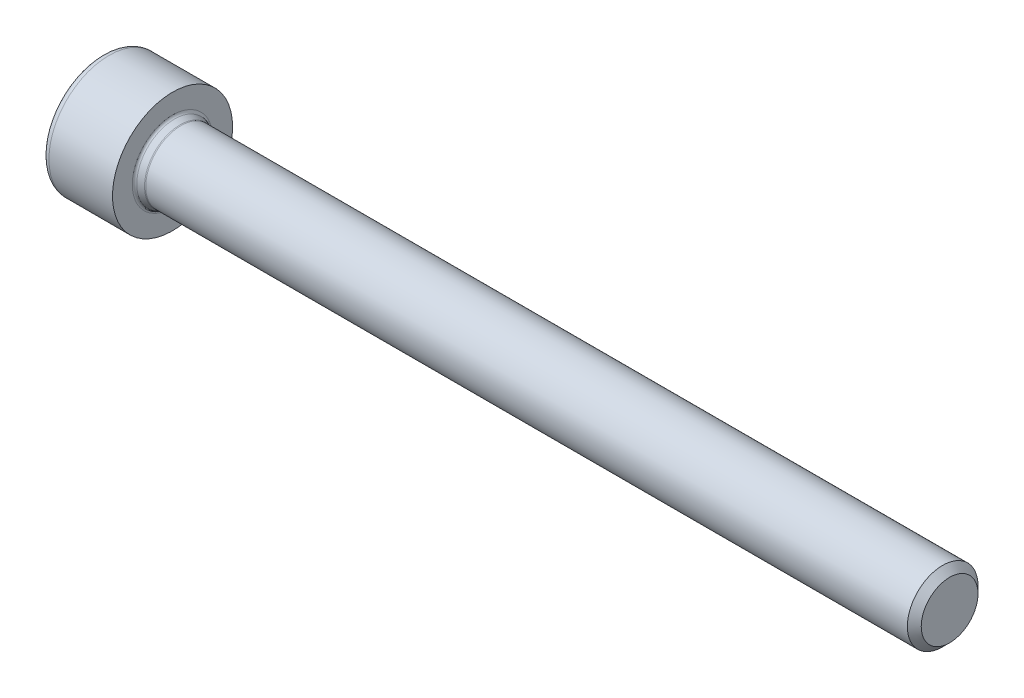
ISO-10303-21;
HEADER;
FILE_DESCRIPTION(('STEP AP214'),'2;1');
FILE_NAME('part.step','',(''),(''),'','','');
FILE_SCHEMA(('AUTOMOTIVE_DESIGN { 1 0 10303 214 1 1 1 1 }'));
ENDSEC;
DATA;
#1=APPLICATION_CONTEXT('core data for automotive mechanical design processes');
#2=APPLICATION_PROTOCOL_DEFINITION('international standard','automotive_design',2000,#1);
#3=PRODUCT_CONTEXT('',#1,'mechanical');
#4=PRODUCT('Part','Part','',(#3));
#5=PRODUCT_RELATED_PRODUCT_CATEGORY('part','',(#4));
#6=PRODUCT_DEFINITION_FORMATION('','',#4);
#7=PRODUCT_DEFINITION_CONTEXT('part definition',#1,'design');
#8=PRODUCT_DEFINITION('design','',#6,#7);
#9=PRODUCT_DEFINITION_SHAPE('','',#8);
#10=(LENGTH_UNIT() NAMED_UNIT(*) SI_UNIT(.MILLI.,.METRE.));
#11=(NAMED_UNIT(*) PLANE_ANGLE_UNIT() SI_UNIT($,.RADIAN.));
#12=(NAMED_UNIT(*) SI_UNIT($,.STERADIAN.) SOLID_ANGLE_UNIT());
#13=UNCERTAINTY_MEASURE_WITH_UNIT(LENGTH_MEASURE(1.E-05),#10,'distance_accuracy_value','');
#14=(GEOMETRIC_REPRESENTATION_CONTEXT(3) GLOBAL_UNCERTAINTY_ASSIGNED_CONTEXT((#13)) GLOBAL_UNIT_ASSIGNED_CONTEXT((#10,
#11,#12)) REPRESENTATION_CONTEXT('',''));
#15=CARTESIAN_POINT('',(0.,0.,0.));
#16=DIRECTION('',(0.,0.,1.));
#17=DIRECTION('',(1.,0.,0.));
#18=AXIS2_PLACEMENT_3D('',#15,#16,#17);
#19=CARTESIAN_POINT('',(-1.9,0.,0.));
#20=DIRECTION('',(1.,0.,0.));
#21=DIRECTION('',(0.,0.,-1.));
#22=AXIS2_PLACEMENT_3D('',#19,#20,#21);
#23=PLANE('',#22);
#24=DIRECTION('',(0.,0.500000000000017,0.866025403784429));
#25=VECTOR('',#24,1.);
#26=CARTESIAN_POINT('',(-1.9,-1.732050807569,1.));
#27=LINE('',#26,#25);
#28=CARTESIAN_POINT('',(-1.9,-1.732050807569,1.));
#29=VERTEX_POINT('',#28);
#30=CARTESIAN_POINT('',(-1.9,-1.154700538379,2.));
#31=VERTEX_POINT('',#30);
#32=EDGE_CURVE('E11',#29,#31,#27,.T.);
#33=ORIENTED_EDGE('',*,*,#32,.T.);
#34=DIRECTION('',(0.,1.,0.));
#35=VECTOR('',#34,1.);
#36=CARTESIAN_POINT('',(-1.9,-1.154700538379,2.));
#37=LINE('',#36,#35);
#38=CARTESIAN_POINT('',(-1.9,0.,2.));
#39=VERTEX_POINT('',#38);
#40=EDGE_CURVE('E32',#31,#39,#37,.T.);
#41=ORIENTED_EDGE('',*,*,#40,.T.);
#42=CARTESIAN_POINT('',(-1.9,0.,0.));
#43=DIRECTION('',(1.,0.,0.));
#44=DIRECTION('',(0.,0.,1.));
#45=AXIS2_PLACEMENT_3D('',#42,#43,#44);
#46=CIRCLE('',#45,2.);
#47=EDGE_CURVE('E303',#39,#29,#46,.T.);
#48=ORIENTED_EDGE('',*,*,#47,.T.);
#49=EDGE_LOOP('',(#33,#41,#48));
#50=FACE_BOUND('',#49,.T.);
#51=ADVANCED_FACE('F17',(#50),#23,.F.);
#52=CARTESIAN_POINT('',(-1.341007426744,0.,0.));
#53=DIRECTION('',(-1.,0.,0.));
#54=DIRECTION('',(0.,0.,-1.));
#55=AXIS2_PLACEMENT_3D('',#52,#53,#54);
#56=CONICAL_SURFACE('',#55,1.031796462067,1.0471975511964);
#57=ORIENTED_EDGE('',*,*,#47,.F.);
#58=CARTESIAN_POINT('',(-1.9,0.,0.));
#59=DIRECTION('',(1.,0.,0.));
#60=DIRECTION('',(0.,0.866025403784429,0.500000000000017));
#61=AXIS2_PLACEMENT_3D('',#58,#59,#60);
#62=CIRCLE('',#61,2.);
#63=CARTESIAN_POINT('',(-1.9,1.732050807569,1.));
#64=VERTEX_POINT('',#63);
#65=EDGE_CURVE('E324',#64,#39,#62,.T.);
#66=ORIENTED_EDGE('',*,*,#65,.F.);
#67=CARTESIAN_POINT('',(-1.9,0.,0.));
#68=DIRECTION('',(1.,0.,0.));
#69=DIRECTION('',(0.,0.866025403784429,-0.500000000000017));
#70=AXIS2_PLACEMENT_3D('',#67,#68,#69);
#71=CIRCLE('',#70,2.);
#72=CARTESIAN_POINT('',(-1.9,1.732050807569,-1.));
#73=VERTEX_POINT('',#72);
#74=EDGE_CURVE('E333',#73,#64,#71,.T.);
#75=ORIENTED_EDGE('',*,*,#74,.F.);
#76=CARTESIAN_POINT('',(-1.9,0.,0.));
#77=DIRECTION('',(1.,0.,0.));
#78=DIRECTION('',(0.,0.,-1.));
#79=AXIS2_PLACEMENT_3D('',#76,#77,#78);
#80=CIRCLE('',#79,2.);
#81=CARTESIAN_POINT('',(-1.9,0.,-2.));
#82=VERTEX_POINT('',#81);
#83=EDGE_CURVE('E405',#82,#73,#80,.T.);
#84=ORIENTED_EDGE('',*,*,#83,.F.);
#85=CARTESIAN_POINT('',(-1.9,0.,0.));
#86=DIRECTION('',(1.,0.,0.));
#87=DIRECTION('',(0.,-0.866025403784429,-0.500000000000017));
#88=AXIS2_PLACEMENT_3D('',#85,#86,#87);
#89=CIRCLE('',#88,2.);
#90=CARTESIAN_POINT('',(-1.9,-1.732050807569,-1.));
#91=VERTEX_POINT('',#90);
#92=EDGE_CURVE('E392',#91,#82,#89,.T.);
#93=ORIENTED_EDGE('',*,*,#92,.F.);
#94=CARTESIAN_POINT('',(-1.9,0.,0.));
#95=DIRECTION('',(1.,0.,0.));
#96=DIRECTION('',(0.,-0.866025403784429,0.500000000000017));
#97=AXIS2_PLACEMENT_3D('',#94,#95,#96);
#98=CIRCLE('',#97,2.);
#99=EDGE_CURVE('E310',#29,#91,#98,.T.);
#100=ORIENTED_EDGE('',*,*,#99,.F.);
#101=EDGE_LOOP('',(#57,#66,#75,#84,#93,#100));
#102=FACE_BOUND('',#101,.T.);
#103=CARTESIAN_POINT('',(-0.7452994616207,0.,0.));
#104=VERTEX_POINT('',#103);
#105=VERTEX_LOOP('',#104);
#106=FACE_BOUND('',#105,.T.);
#107=ADVANCED_FACE('F292',(#102,#106),#56,.F.);
#108=CARTESIAN_POINT('',(-1.9,0.,0.));
#109=DIRECTION('',(1.,0.,0.));
#110=DIRECTION('',(0.,0.,-1.));
#111=AXIS2_PLACEMENT_3D('',#108,#109,#110);
#112=PLANE('',#111);
#113=DIRECTION('',(0.,-0.500000000000017,-0.866025403784429));
#114=VECTOR('',#113,1.);
#115=CARTESIAN_POINT('',(-1.9,1.732050807569,-1.));
#116=LINE('',#115,#114);
#117=CARTESIAN_POINT('',(-1.9,1.154700538379,-2.));
#118=VERTEX_POINT('',#117);
#119=EDGE_CURVE('E409',#73,#118,#116,.T.);
#120=ORIENTED_EDGE('',*,*,#119,.T.);
#121=DIRECTION('',(0.,-1.,0.));
#122=VECTOR('',#121,1.);
#123=CARTESIAN_POINT('',(-1.9,1.154700538379,-2.));
#124=LINE('',#123,#122);
#125=EDGE_CURVE('E408',#118,#82,#124,.T.);
#126=ORIENTED_EDGE('',*,*,#125,.T.);
#127=ORIENTED_EDGE('',*,*,#83,.T.);
#128=EDGE_LOOP('',(#120,#126,#127));
#129=FACE_BOUND('',#128,.T.);
#130=ADVANCED_FACE('F174',(#129),#112,.F.);
#131=CARTESIAN_POINT('',(-1.9,-1.154700538379,-2.));
#132=DIRECTION('',(0.,0.,-1.));
#133=DIRECTION('',(0.,-1.,0.));
#134=AXIS2_PLACEMENT_3D('',#131,#132,#133);
#135=PLANE('',#134);
#136=DIRECTION('',(1.,0.,0.));
#137=VECTOR('',#136,1.);
#138=CARTESIAN_POINT('',(-5.,-1.154700538379,-2.));
#139=LINE('',#138,#137);
#140=CARTESIAN_POINT('',(-5.,-1.154700538379,-2.));
#141=VERTEX_POINT('',#140);
#142=CARTESIAN_POINT('',(-1.9,-1.154700538379,-2.));
#143=VERTEX_POINT('',#142);
#144=EDGE_CURVE('E335',#141,#143,#139,.T.);
#145=ORIENTED_EDGE('',*,*,#144,.T.);
#146=DIRECTION('',(0.,-1.,0.));
#147=VECTOR('',#146,1.);
#148=CARTESIAN_POINT('',(-1.9,0.,-2.));
#149=LINE('',#148,#147);
#150=EDGE_CURVE('E388',#82,#143,#149,.T.);
#151=ORIENTED_EDGE('',*,*,#150,.F.);
#152=ORIENTED_EDGE('',*,*,#125,.F.);
#153=DIRECTION('',(1.,0.,0.));
#154=VECTOR('',#153,1.);
#155=CARTESIAN_POINT('',(-5.,1.154700538379,-2.));
#156=LINE('',#155,#154);
#157=CARTESIAN_POINT('',(-5.,1.154700538379,-2.));
#158=VERTEX_POINT('',#157);
#159=EDGE_CURVE('E139',#158,#118,#156,.T.);
#160=ORIENTED_EDGE('',*,*,#159,.F.);
#161=DIRECTION('',(0.,-1.,-2.056165711993E-12));
#162=VECTOR('',#161,1.);
#163=CARTESIAN_POINT('',(-5.,1.154700538379,-2.));
#164=LINE('',#163,#162);
#165=CARTESIAN_POINT('',(-5.00000000000006,1.11539230766579,-2.00000000000004));
#166=VERTEX_POINT('',#165);
#167=EDGE_CURVE('E148',#158,#166,#164,.T.);
#168=ORIENTED_EDGE('',*,*,#167,.T.);
#169=CARTESIAN_POINT('',(-5.00000000000012,1.11539230766594,-2.));
#170=CARTESIAN_POINT('',(-4.96269814449594,1.03875187572664,-2.));
#171=CARTESIAN_POINT('',(-4.92766545046626,0.960859965510337,-2.));
#172=CARTESIAN_POINT('',(-4.86361899879747,0.80212848558091,-2.));
#173=CARTESIAN_POINT('',(-4.83464179749017,0.721274291311404,-2.));
#174=CARTESIAN_POINT('',(-4.78476371210365,0.557399580935184,-2.));
#175=CARTESIAN_POINT('',(-4.76383126694452,0.474388923288808,-2.));
#176=CARTESIAN_POINT('',(-4.73171111631264,0.306665453386401,-2.));
#177=CARTESIAN_POINT('',(-4.72049551962026,0.221958231857297,-2.));
#178=CARTESIAN_POINT('',(-4.713123963907,0.114142700229891,-2.));
#179=CARTESIAN_POINT('',(-4.71195378897668,0.0913253973918122,-2.));
#180=CARTESIAN_POINT('',(-4.71039159744207,0.0456731167432087,-2.));
#181=CARTESIAN_POINT('',(-4.70999925996975,0.0228381501097261,-2.));
#182=CARTESIAN_POINT('',(-4.71000196698193,-0.0607032374814076,-2.));
#183=CARTESIAN_POINT('',(-4.71278096062686,-0.121428965688822,-2.));
#184=CARTESIAN_POINT('',(-4.7237319806972,-0.242406475247265,-2.));
#185=CARTESIAN_POINT('',(-4.73190782969933,-0.302657890011732,-2.));
#186=CARTESIAN_POINT('',(-4.76401185468268,-0.482572080413143,-2.));
#187=CARTESIAN_POINT('',(-4.79551147455875,-0.600926459221163,-2.));
#188=CARTESIAN_POINT('',(-4.85760161139453,-0.785122293123561,-2.));
#189=CARTESIAN_POINT('',(-4.88334390832426,-0.852730613369394,-2.));
#190=CARTESIAN_POINT('',(-4.9388730724376,-0.985615235138587,-2.));
#191=CARTESIAN_POINT('',(-4.96862446147152,-1.05090627128606,-2.));
#192=CARTESIAN_POINT('',(-5.00000000000012,-1.11539230766594,-2.));
#193=B_SPLINE_CURVE_WITH_KNOTS('',3,(#169,#170,#171,#172,#173,#174,#175,#176,#177,#178,#179,
#180,#181,#182,#183,#184,#185,#186,#187,#188,#189,#190,#191,#192),.UNSPECIFIED.,.F.,.F.,(4,2,2,
2,2,2,2,2,2,2,2,4),(0.,0.255872334413172,0.513247357951934,0.769602085042758,1.02521851074875,
1.09375136973413,1.16225595213943,1.34433943588631,1.52655202741257,1.89236369423363,
2.10928491886981,2.3243991581952),.UNSPECIFIED.);
#194=CARTESIAN_POINT('',(-5.00000000000006,-1.11539230766582,-2.));
#195=VERTEX_POINT('',#194);
#196=EDGE_CURVE('E155',#166,#195,#193,.T.);
#197=ORIENTED_EDGE('',*,*,#196,.T.);
#198=DIRECTION('',(0.,-1.,2.033570484389E-12));
#199=VECTOR('',#198,1.);
#200=CARTESIAN_POINT('',(-5.,-1.115392307666,-2.));
#201=LINE('',#200,#199);
#202=EDGE_CURVE('E161',#195,#141,#201,.T.);
#203=ORIENTED_EDGE('',*,*,#202,.T.);
#204=EDGE_LOOP('',(#145,#151,#152,#160,#168,#197,#203));
#205=FACE_BOUND('',#204,.T.);
#206=ADVANCED_FACE('F169',(#205),#135,.F.);
#207=CARTESIAN_POINT('',(-5.,0.,-3.02));
#208=DIRECTION('',(-1.,0.,0.));
#209=DIRECTION('',(0.,0.,-1.));
#210=AXIS2_PLACEMENT_3D('',#207,#208,#209);
#211=PLANE('',#210);
#212=CARTESIAN_POINT('',(-5.,0.,0.));
#213=DIRECTION('',(-1.,0.,0.));
#214=DIRECTION('',(0.,0.,1.));
#215=AXIS2_PLACEMENT_3D('',#212,#213,#214);
#216=CIRCLE('',#215,3.75);
#217=CARTESIAN_POINT('',(-5.,0.,3.75));
#218=VERTEX_POINT('',#217);
#219=EDGE_CURVE('E151',#218,#218,#216,.T.);
#220=ORIENTED_EDGE('',*,*,#219,.T.);
#221=EDGE_LOOP('',(#220));
#222=FACE_BOUND('',#221,.T.);
#223=ORIENTED_EDGE('',*,*,#202,.F.);
#224=CARTESIAN_POINT('',(-5.,0.,0.));
#225=DIRECTION('',(1.,0.,0.));
#226=DIRECTION('',(0.,-0.487070876709932,-0.873362445414857));
#227=AXIS2_PLACEMENT_3D('',#224,#225,#226);
#228=CIRCLE('',#227,2.29);
#229=EDGE_CURVE('E149',#195,#166,#228,.T.);
#230=ORIENTED_EDGE('',*,*,#229,.T.);
#231=ORIENTED_EDGE('',*,*,#167,.F.);
#232=DIRECTION('',(0.,0.5000000000018,0.8660254037834));
#233=VECTOR('',#232,1.);
#234=CARTESIAN_POINT('',(-5.,1.154700538379,-2.));
#235=LINE('',#234,#233);
#236=CARTESIAN_POINT('',(-5.,1.1743546537357,-1.96595807362446));
#237=VERTEX_POINT('',#236);
#238=EDGE_CURVE('E137',#158,#237,#235,.T.);
#239=ORIENTED_EDGE('',*,*,#238,.T.);
#240=CARTESIAN_POINT('',(-5.,0.,0.));
#241=DIRECTION('',(1.,0.,0.));
#242=DIRECTION('',(0.,0.512818626085595,-0.858496975381791));
#243=AXIS2_PLACEMENT_3D('',#240,#241,#242);
#244=CIRCLE('',#243,2.29);
#245=CARTESIAN_POINT('',(-5.,2.28974696140174,-0.0340419263758867));
#246=VERTEX_POINT('',#245);
#247=EDGE_CURVE('E140',#237,#246,#244,.T.);
#248=ORIENTED_EDGE('',*,*,#247,.T.);
#249=DIRECTION('',(0.,0.49999999999819,0.866025403785483));
#250=VECTOR('',#249,1.);
#251=CARTESIAN_POINT('',(-5.,2.289746961402,-0.03404192637595));
#252=LINE('',#251,#250);
#253=CARTESIAN_POINT('',(-5.,2.309401076759,0.));
#254=VERTEX_POINT('',#253);
#255=EDGE_CURVE('E129',#246,#254,#252,.T.);
#256=ORIENTED_EDGE('',*,*,#255,.T.);
#257=DIRECTION('',(0.,-0.49999999999819,0.866025403785483));
#258=VECTOR('',#257,1.);
#259=CARTESIAN_POINT('',(-5.,2.309401076759,0.));
#260=LINE('',#259,#258);
#261=CARTESIAN_POINT('',(-5.,2.28974696140174,0.0340419263758006));
#262=VERTEX_POINT('',#261);
#263=EDGE_CURVE('E364',#254,#262,#260,.T.);
#264=ORIENTED_EDGE('',*,*,#263,.T.);
#265=CARTESIAN_POINT('',(-5.,0.,0.));
#266=DIRECTION('',(1.,0.,0.));
#267=DIRECTION('',(0.,0.999889502795532,0.0148654700330505));
#268=AXIS2_PLACEMENT_3D('',#265,#266,#267);
#269=CIRCLE('',#268,2.29);
#270=CARTESIAN_POINT('',(-5.,1.17435465373546,1.96595807362461));
#271=VERTEX_POINT('',#270);
#272=EDGE_CURVE('E361',#262,#271,#269,.T.);
#273=ORIENTED_EDGE('',*,*,#272,.T.);
#274=DIRECTION('',(0.,-0.5000000000018,0.8660254037834));
#275=VECTOR('',#274,1.);
#276=CARTESIAN_POINT('',(-5.,1.174354653736,1.965958073624));
#277=LINE('',#276,#275);
#278=CARTESIAN_POINT('',(-5.,1.154700538379,2.));
#279=VERTEX_POINT('',#278);
#280=EDGE_CURVE('E358',#271,#279,#277,.T.);
#281=ORIENTED_EDGE('',*,*,#280,.T.);
#282=DIRECTION('',(0.,1.,-2.044868098192E-12));
#283=VECTOR('',#282,1.);
#284=CARTESIAN_POINT('',(-5.,1.115392307666,2.));
#285=LINE('',#284,#283);
#286=CARTESIAN_POINT('',(-5.,1.11539230766574,2.));
#287=VERTEX_POINT('',#286);
#288=EDGE_CURVE('E246',#287,#279,#285,.T.);
#289=ORIENTED_EDGE('',*,*,#288,.F.);
#290=CARTESIAN_POINT('',(-5.,0.,0.));
#291=DIRECTION('',(1.,0.,0.));
#292=DIRECTION('',(0.,0.487070876709932,0.873362445414857));
#293=AXIS2_PLACEMENT_3D('',#290,#291,#292);
#294=CIRCLE('',#293,2.29);
#295=CARTESIAN_POINT('',(-5.,-1.11539230766567,2.00000000000004));
#296=VERTEX_POINT('',#295);
#297=EDGE_CURVE('E354',#287,#296,#294,.T.);
#298=ORIENTED_EDGE('',*,*,#297,.T.);
#299=DIRECTION('',(0.,1.,2.056165711993E-12));
#300=VECTOR('',#299,1.);
#301=CARTESIAN_POINT('',(-5.,-1.154700538379,2.));
#302=LINE('',#301,#300);
#303=CARTESIAN_POINT('',(-5.,-1.154700538379,2.));
#304=VERTEX_POINT('',#303);
#305=EDGE_CURVE('E252',#304,#296,#302,.T.);
#306=ORIENTED_EDGE('',*,*,#305,.F.);
#307=DIRECTION('',(0.,-0.5000000000018,-0.8660254037834));
#308=VECTOR('',#307,1.);
#309=CARTESIAN_POINT('',(-5.,-1.154700538379,2.));
#310=LINE('',#309,#308);
#311=CARTESIAN_POINT('',(-5.,-1.1743546537357,1.96595807362446));
#312=VERTEX_POINT('',#311);
#313=EDGE_CURVE('E308',#304,#312,#310,.T.);
#314=ORIENTED_EDGE('',*,*,#313,.T.);
#315=CARTESIAN_POINT('',(-5.,0.,0.));
#316=DIRECTION('',(1.,0.,0.));
#317=DIRECTION('',(0.,-0.512818626085595,0.858496975381791));
#318=AXIS2_PLACEMENT_3D('',#315,#316,#317);
#319=CIRCLE('',#318,2.29);
#320=CARTESIAN_POINT('',(-5.,-2.28974696140174,0.0340419263758918));
#321=VERTEX_POINT('',#320);
#322=EDGE_CURVE('E350',#312,#321,#319,.T.);
#323=ORIENTED_EDGE('',*,*,#322,.T.);
#324=DIRECTION('',(0.,-0.49999999999819,-0.866025403785483));
#325=VECTOR('',#324,1.);
#326=CARTESIAN_POINT('',(-5.,-2.289746961402,0.03404192637596));
#327=LINE('',#326,#325);
#328=CARTESIAN_POINT('',(-5.,-2.309401076759,0.));
#329=VERTEX_POINT('',#328);
#330=EDGE_CURVE('E347',#321,#329,#327,.T.);
#331=ORIENTED_EDGE('',*,*,#330,.T.);
#332=DIRECTION('',(0.,0.49999999999819,-0.866025403785483));
#333=VECTOR('',#332,1.);
#334=CARTESIAN_POINT('',(-5.,-2.309401076759,0.));
#335=LINE('',#334,#333);
#336=CARTESIAN_POINT('',(-5.,-2.28974696140174,-0.0340419263758006));
#337=VERTEX_POINT('',#336);
#338=EDGE_CURVE('E344',#329,#337,#335,.T.);
#339=ORIENTED_EDGE('',*,*,#338,.T.);
#340=CARTESIAN_POINT('',(-5.,0.,0.));
#341=DIRECTION('',(1.,0.,0.));
#342=DIRECTION('',(0.,-0.999889502795532,-0.0148654700330505));
#343=AXIS2_PLACEMENT_3D('',#340,#341,#342);
#344=CIRCLE('',#343,2.29);
#345=CARTESIAN_POINT('',(-5.,-1.17435465373546,-1.96595807362461));
#346=VERTEX_POINT('',#345);
#347=EDGE_CURVE('E340',#337,#346,#344,.T.);
#348=ORIENTED_EDGE('',*,*,#347,.T.);
#349=DIRECTION('',(0.,0.5000000000018,-0.8660254037834));
#350=VECTOR('',#349,1.);
#351=CARTESIAN_POINT('',(-5.,-1.174354653736,-1.965958073624));
#352=LINE('',#351,#350);
#353=EDGE_CURVE('E337',#346,#141,#352,.T.);
#354=ORIENTED_EDGE('',*,*,#353,.T.);
#355=EDGE_LOOP('',(#223,#230,#231,#239,#248,#256,#264,#273,#281,#289,#298,#306,#314,#323,#331,
#339,#348,#354));
#356=FACE_BOUND('',#355,.T.);
#357=ADVANCED_FACE('F146',(#222,#356),#211,.T.);
#358=CARTESIAN_POINT('',(-4.5,0.,0.));
#359=DIRECTION('',(-1.,0.,0.));
#360=DIRECTION('',(0.,0.,1.));
#361=AXIS2_PLACEMENT_3D('',#358,#359,#360);
#362=TOROIDAL_SURFACE('',#361,3.75,0.5);
#363=CARTESIAN_POINT('',(-4.5,0.,0.));
#364=DIRECTION('',(-1.,0.,0.));
#365=DIRECTION('',(0.,0.,-1.));
#366=AXIS2_PLACEMENT_3D('',#363,#364,#365);
#367=CIRCLE('',#366,4.25);
#368=CARTESIAN_POINT('',(-4.5,0.,-4.25));
#369=VERTEX_POINT('',#368);
#370=EDGE_CURVE('E341',#369,#369,#367,.T.);
#371=ORIENTED_EDGE('',*,*,#370,.T.);
#372=EDGE_LOOP('',(#371));
#373=FACE_BOUND('',#372,.T.);
#374=ORIENTED_EDGE('',*,*,#219,.F.);
#375=EDGE_LOOP('',(#374));
#376=FACE_BOUND('',#375,.T.);
#377=ADVANCED_FACE('F179',(#373,#376),#362,.T.);
#378=CARTESIAN_POINT('',(-2.25,0.,0.));
#379=DIRECTION('',(1.,0.,0.));
#380=DIRECTION('',(0.,0.,-1.));
#381=AXIS2_PLACEMENT_3D('',#378,#379,#380);
#382=CYLINDRICAL_SURFACE('',#381,4.25);
#383=CARTESIAN_POINT('',(0.,0.,0.));
#384=DIRECTION('',(1.,0.,0.));
#385=DIRECTION('',(0.,0.,-1.));
#386=AXIS2_PLACEMENT_3D('',#383,#384,#385);
#387=CIRCLE('',#386,4.25);
#388=CARTESIAN_POINT('',(0.,0.,-4.25));
#389=VERTEX_POINT('',#388);
#390=EDGE_CURVE('E421',#389,#389,#387,.T.);
#391=ORIENTED_EDGE('',*,*,#390,.F.);
#392=EDGE_LOOP('',(#391));
#393=FACE_BOUND('',#392,.T.);
#394=ORIENTED_EDGE('',*,*,#370,.F.);
#395=EDGE_LOOP('',(#394));
#396=FACE_BOUND('',#395,.T.);
#397=ADVANCED_FACE('F183',(#393,#396),#382,.T.);
#398=CARTESIAN_POINT('',(0.,0.,-3.55));
#399=DIRECTION('',(1.,0.,0.));
#400=DIRECTION('',(0.,0.,1.));
#401=AXIS2_PLACEMENT_3D('',#398,#399,#400);
#402=PLANE('',#401);
#403=ORIENTED_EDGE('',*,*,#390,.T.);
#404=EDGE_LOOP('',(#403));
#405=FACE_BOUND('',#404,.T.);
#406=CARTESIAN_POINT('',(0.,0.,0.));
#407=DIRECTION('',(-1.,0.,0.));
#408=DIRECTION('',(0.,0.,1.));
#409=AXIS2_PLACEMENT_3D('',#406,#407,#408);
#410=CIRCLE('',#409,2.85);
#411=CARTESIAN_POINT('',(0.,0.,2.85));
#412=VERTEX_POINT('',#411);
#413=EDGE_CURVE('E424',#412,#412,#410,.T.);
#414=ORIENTED_EDGE('',*,*,#413,.T.);
#415=EDGE_LOOP('',(#414));
#416=FACE_BOUND('',#415,.T.);
#417=ADVANCED_FACE('F187',(#405,#416),#402,.T.);
#418=CARTESIAN_POINT('',(0.2,0.,0.));
#419=DIRECTION('',(-1.,0.,0.));
#420=DIRECTION('',(0.,0.,1.));
#421=AXIS2_PLACEMENT_3D('',#418,#419,#420);
#422=TOROIDAL_SURFACE('',#421,2.85,0.2);
#423=CARTESIAN_POINT('',(0.1297753116823,0.,0.));
#424=DIRECTION('',(-1.,0.,0.));
#425=DIRECTION('',(0.,0.,-1.));
#426=AXIS2_PLACEMENT_3D('',#423,#424,#425);
#427=CIRCLE('',#426,2.662734164486);
#428=CARTESIAN_POINT('',(0.1297753116823,0.,-2.662734164486));
#429=VERTEX_POINT('',#428);
#430=EDGE_CURVE('E427',#429,#429,#427,.T.);
#431=ORIENTED_EDGE('',*,*,#430,.T.);
#432=EDGE_LOOP('',(#431));
#433=FACE_BOUND('',#432,.T.);
#434=ORIENTED_EDGE('',*,*,#413,.F.);
#435=EDGE_LOOP('',(#434));
#436=FACE_BOUND('',#435,.T.);
#437=ADVANCED_FACE('F191',(#433,#436),#422,.F.);
#438=CARTESIAN_POINT('',(0.3297753116823,0.,0.));
#439=DIRECTION('',(-1.,0.,0.));
#440=DIRECTION('',(0.,0.,-1.));
#441=AXIS2_PLACEMENT_3D('',#438,#439,#440);
#442=CONICAL_SURFACE('',#441,2.587734164486,0.358770670270444);
#443=CARTESIAN_POINT('',(0.5297753116823,0.,0.));
#444=DIRECTION('',(1.,0.,0.));
#445=DIRECTION('',(0.,0.,-1.));
#446=AXIS2_PLACEMENT_3D('',#443,#444,#445);
#447=CIRCLE('',#446,2.512734164486);
#448=CARTESIAN_POINT('',(0.5297753116823,0.,-2.512734164486));
#449=VERTEX_POINT('',#448);
#450=EDGE_CURVE('E431',#449,#449,#447,.T.);
#451=ORIENTED_EDGE('',*,*,#450,.F.);
#452=EDGE_LOOP('',(#451));
#453=FACE_BOUND('',#452,.T.);
#454=ORIENTED_EDGE('',*,*,#430,.F.);
#455=EDGE_LOOP('',(#454));
#456=FACE_BOUND('',#455,.T.);
#457=ADVANCED_FACE('F195',(#453,#456),#442,.T.);
#458=CARTESIAN_POINT('',(0.6,0.,0.));
#459=DIRECTION('',(-1.,0.,0.));
#460=DIRECTION('',(0.,0.,1.));
#461=AXIS2_PLACEMENT_3D('',#458,#459,#460);
#462=TOROIDAL_SURFACE('',#461,2.7,0.2000000000001);
#463=CARTESIAN_POINT('',(0.6,0.,0.));
#464=DIRECTION('',(-1.,0.,0.));
#465=DIRECTION('',(0.,0.,-1.));
#466=AXIS2_PLACEMENT_3D('',#463,#464,#465);
#467=CIRCLE('',#466,2.5);
#468=CARTESIAN_POINT('',(0.6,0.,-2.5));
#469=VERTEX_POINT('',#468);
#470=EDGE_CURVE('E430',#469,#469,#467,.T.);
#471=ORIENTED_EDGE('',*,*,#470,.T.);
#472=EDGE_LOOP('',(#471));
#473=FACE_BOUND('',#472,.T.);
#474=ORIENTED_EDGE('',*,*,#450,.T.);
#475=EDGE_LOOP('',(#474));
#476=FACE_BOUND('',#475,.T.);
#477=ADVANCED_FACE('F199',(#473,#476),#462,.F.);
#478=CARTESIAN_POINT('',(27.55475,0.,0.));
#479=DIRECTION('',(1.,0.,0.));
#480=DIRECTION('',(0.,0.,-1.));
#481=AXIS2_PLACEMENT_3D('',#478,#479,#480);
#482=CYLINDRICAL_SURFACE('',#481,2.5);
#483=CARTESIAN_POINT('',(54.5095,0.,0.));
#484=DIRECTION('',(1.,0.,0.));
#485=DIRECTION('',(0.,0.,-1.));
#486=AXIS2_PLACEMENT_3D('',#483,#484,#485);
#487=CIRCLE('',#486,2.5);
#488=CARTESIAN_POINT('',(54.5095,0.,-2.5));
#489=VERTEX_POINT('',#488);
#490=EDGE_CURVE('E386',#489,#489,#487,.T.);
#491=ORIENTED_EDGE('',*,*,#490,.F.);
#492=EDGE_LOOP('',(#491));
#493=FACE_BOUND('',#492,.T.);
#494=ORIENTED_EDGE('',*,*,#470,.F.);
#495=EDGE_LOOP('',(#494));
#496=FACE_BOUND('',#495,.T.);
#497=ADVANCED_FACE('F203',(#493,#496),#482,.T.);
#498=CARTESIAN_POINT('',(54.75475,0.,0.));
#499=DIRECTION('',(-1.,0.,0.));
#500=DIRECTION('',(0.,0.,-1.));
#501=AXIS2_PLACEMENT_3D('',#498,#499,#500);
#502=CONICAL_SURFACE('',#501,2.25475,0.7853981633973);
#503=CARTESIAN_POINT('',(55.,0.,0.));
#504=DIRECTION('',(1.,0.,0.));
#505=DIRECTION('',(0.,0.,1.));
#506=AXIS2_PLACEMENT_3D('',#503,#504,#505);
#507=CIRCLE('',#506,2.0095);
#508=CARTESIAN_POINT('',(55.,0.,2.0095));
#509=VERTEX_POINT('',#508);
#510=EDGE_CURVE('E383',#509,#509,#507,.T.);
#511=ORIENTED_EDGE('',*,*,#510,.F.);
#512=EDGE_LOOP('',(#511));
#513=FACE_BOUND('',#512,.T.);
#514=ORIENTED_EDGE('',*,*,#490,.T.);
#515=EDGE_LOOP('',(#514));
#516=FACE_BOUND('',#515,.T.);
#517=ADVANCED_FACE('F207',(#513,#516),#502,.T.);
#518=CARTESIAN_POINT('',(55.,0.,-1.00475));
#519=DIRECTION('',(1.,0.,0.));
#520=DIRECTION('',(0.,0.,1.));
#521=AXIS2_PLACEMENT_3D('',#518,#519,#520);
#522=PLANE('',#521);
#523=ORIENTED_EDGE('',*,*,#510,.T.);
#524=EDGE_LOOP('',(#523));
#525=FACE_BOUND('',#524,.T.);
#526=ADVANCED_FACE('F211',(#525),#522,.T.);
#527=CARTESIAN_POINT('',(-1.9,-2.309401076758,0.));
#528=DIRECTION('',(0.,-0.866025403784429,-0.500000000000017));
#529=DIRECTION('',(0.,-0.500000000000017,0.866025403784429));
#530=AXIS2_PLACEMENT_3D('',#527,#528,#529);
#531=PLANE('',#530);
#532=DIRECTION('',(1.,0.,0.));
#533=VECTOR('',#532,1.);
#534=CARTESIAN_POINT('',(-5.,-2.309401076759,0.));
#535=LINE('',#534,#533);
#536=CARTESIAN_POINT('',(-1.9,-2.309401076759,0.));
#537=VERTEX_POINT('',#536);
#538=EDGE_CURVE('E381',#329,#537,#535,.T.);
#539=ORIENTED_EDGE('',*,*,#538,.T.);
#540=DIRECTION('',(0.,-0.500000000000017,0.866025403784429));
#541=VECTOR('',#540,1.);
#542=CARTESIAN_POINT('',(-1.9,-1.732050807569,-1.));
#543=LINE('',#542,#541);
#544=EDGE_CURVE('E391',#91,#537,#543,.T.);
#545=ORIENTED_EDGE('',*,*,#544,.F.);
#546=DIRECTION('',(0.,-0.500000000000017,0.866025403784429));
#547=VECTOR('',#546,1.);
#548=CARTESIAN_POINT('',(-1.9,-1.154700538379,-2.));
#549=LINE('',#548,#547);
#550=EDGE_CURVE('E393',#143,#91,#549,.T.);
#551=ORIENTED_EDGE('',*,*,#550,.F.);
#552=ORIENTED_EDGE('',*,*,#144,.F.);
#553=ORIENTED_EDGE('',*,*,#353,.F.);
#554=CARTESIAN_POINT('',(-4.99999999999959,-1.17435465373561,-1.96595807362401));
#555=CARTESIAN_POINT('',(-4.96269814449542,-1.21267486970525,-1.89958551260758));
#556=CARTESIAN_POINT('',(-4.92766545046575,-1.2516208248134,-1.83212913961098));
#557=CARTESIAN_POINT('',(-4.86361899879697,-1.33098656477809,-1.69466364561183));
#558=CARTESIAN_POINT('',(-4.83464179748968,-1.37141366191284,-1.62464185937194));
#559=CARTESIAN_POINT('',(-4.78476371210317,-1.45335101710093,-1.48272219714835));
#560=CARTESIAN_POINT('',(-4.76383126694405,-1.49485634592411,-1.41083285884175));
#561=CARTESIAN_POINT('',(-4.73171111631217,-1.57871808087529,-1.26558007309543));
#562=CARTESIAN_POINT('',(-4.7204955196198,-1.62107169163984,-1.19222146736725));
#563=CARTESIAN_POINT('',(-4.71312396390654,-1.67497945745354,-1.0988504780554));
#564=CARTESIAN_POINT('',(-4.71195378897622,-1.68638810887258,-1.07909011415177));
#565=CARTESIAN_POINT('',(-4.71039159744162,-1.7092142491969,-1.03955407936937));
#566=CARTESIAN_POINT('',(-4.70999925996929,-1.72063173251364,-1.01977841817019));
#567=CARTESIAN_POINT('',(-4.71000196698148,-1.76240242630921,-0.94742945424887));
#568=CARTESIAN_POINT('',(-4.71278096062641,-1.79276529041291,-0.89483943095795));
#569=CARTESIAN_POINT('',(-4.72373198069675,-1.85325404519212,-0.790069834393785));
#570=CARTESIAN_POINT('',(-4.73190782969888,-1.88337975257435,-0.737890578593815));
#571=CARTESIAN_POINT('',(-4.76401185468224,-1.97333684777504,-0.582080319204916));
#572=CARTESIAN_POINT('',(-4.79551147455831,-2.03251403717904,-0.479582420508065));
#573=CARTESIAN_POINT('',(-4.85760161139408,-2.12461195413023,-0.320064149077357));
#574=CARTESIAN_POINT('',(-4.88334390832382,-2.15841611425315,-0.261513626237278));
#575=CARTESIAN_POINT('',(-4.93887307243716,-2.22485842513774,-0.146432168012882));
#576=CARTESIAN_POINT('',(-4.96862446147108,-2.25750394321147,-0.0898884720697648));
#577=CARTESIAN_POINT('',(-4.99999999999968,-2.28974696140141,-0.0340419263754307));
#578=B_SPLINE_CURVE_WITH_KNOTS('',3,(#554,#555,#556,#557,#558,#559,#560,#561,#562,#563,#564,
#565,#566,#567,#568,#569,#570,#571,#572,#573,#574,#575,#576,#577),.UNSPECIFIED.,.F.,.F.,(4,2,2,
2,2,2,2,2,2,2,2,4),(0.,0.255872334413109,0.513247357951807,0.769602085042567,1.0252185107485,
1.09375136973391,1.16225595213924,1.34433943588609,1.52655202741232,1.8923636942333,
2.10928491886947,2.32439915819484),.UNSPECIFIED.);
#579=EDGE_CURVE('E162',#346,#337,#578,.T.);
#580=ORIENTED_EDGE('',*,*,#579,.T.);
#581=ORIENTED_EDGE('',*,*,#338,.F.);
#582=EDGE_LOOP('',(#539,#545,#551,#552,#553,#580,#581));
#583=FACE_BOUND('',#582,.T.);
#584=ADVANCED_FACE('F214',(#583),#531,.F.);
#585=CARTESIAN_POINT('',(-4.855,0.,0.));
#586=DIRECTION('',(-1.,0.,0.));
#587=DIRECTION('',(0.,0.,-1.));
#588=AXIS2_PLACEMENT_3D('',#585,#586,#587);
#589=CONICAL_SURFACE('',#588,2.145,0.7853981633973);
#590=ORIENTED_EDGE('',*,*,#347,.F.);
#591=ORIENTED_EDGE('',*,*,#579,.F.);
#592=EDGE_LOOP('',(#590,#591));
#593=FACE_BOUND('',#592,.T.);
#594=ADVANCED_FACE('F218',(#593),#589,.F.);
#595=CARTESIAN_POINT('',(-1.9,0.,0.));
#596=DIRECTION('',(1.,0.,0.));
#597=DIRECTION('',(0.,0.,-1.));
#598=AXIS2_PLACEMENT_3D('',#595,#596,#597);
#599=PLANE('',#598);
#600=ORIENTED_EDGE('',*,*,#150,.T.);
#601=ORIENTED_EDGE('',*,*,#550,.T.);
#602=ORIENTED_EDGE('',*,*,#92,.T.);
#603=EDGE_LOOP('',(#600,#601,#602));
#604=FACE_BOUND('',#603,.T.);
#605=ADVANCED_FACE('F223',(#604),#599,.F.);
#606=CARTESIAN_POINT('',(-1.9,0.,0.));
#607=DIRECTION('',(1.,0.,0.));
#608=DIRECTION('',(0.,0.,-1.));
#609=AXIS2_PLACEMENT_3D('',#606,#607,#608);
#610=PLANE('',#609);
#611=ORIENTED_EDGE('',*,*,#544,.T.);
#612=DIRECTION('',(0.,0.500000000000017,0.866025403784429));
#613=VECTOR('',#612,1.);
#614=CARTESIAN_POINT('',(-1.9,-2.309401076759,0.));
#615=LINE('',#614,#613);
#616=EDGE_CURVE('E312',#537,#29,#615,.T.);
#617=ORIENTED_EDGE('',*,*,#616,.T.);
#618=ORIENTED_EDGE('',*,*,#99,.T.);
#619=EDGE_LOOP('',(#611,#617,#618));
#620=FACE_BOUND('',#619,.T.);
#621=ADVANCED_FACE('F227',(#620),#610,.F.);
#622=CARTESIAN_POINT('',(-1.9,-1.154700538379,2.));
#623=DIRECTION('',(0.,-0.866025403784429,0.500000000000017));
#624=DIRECTION('',(0.,0.500000000000017,0.866025403784429));
#625=AXIS2_PLACEMENT_3D('',#622,#623,#624);
#626=PLANE('',#625);
#627=DIRECTION('',(1.,0.,0.));
#628=VECTOR('',#627,1.);
#629=CARTESIAN_POINT('',(-5.,-1.154700538379,2.));
#630=LINE('',#629,#628);
#631=EDGE_CURVE('E245',#304,#31,#630,.T.);
#632=ORIENTED_EDGE('',*,*,#631,.T.);
#633=ORIENTED_EDGE('',*,*,#32,.F.);
#634=ORIENTED_EDGE('',*,*,#616,.F.);
#635=ORIENTED_EDGE('',*,*,#538,.F.);
#636=ORIENTED_EDGE('',*,*,#330,.F.);
#637=CARTESIAN_POINT('',(-4.99999999999996,-2.28974696140168,0.0340419263754828));
#638=CARTESIAN_POINT('',(-4.96269814449577,-2.25142674543203,0.100414487391926));
#639=CARTESIAN_POINT('',(-4.92766545046609,-2.21248079032388,0.167870860388542));
#640=CARTESIAN_POINT('',(-4.86361899879729,-2.13311505035916,0.305336354387723));
#641=CARTESIAN_POINT('',(-4.83464179748999,-2.09268795322441,0.375358140627636));
#642=CARTESIAN_POINT('',(-4.78476371210347,-2.0107505980363,0.517277802851258));
#643=CARTESIAN_POINT('',(-4.76383126694434,-1.96924526921311,0.589167141157872));
#644=CARTESIAN_POINT('',(-4.73171111631245,-1.8853835342619,0.73441992690423));
#645=CARTESIAN_POINT('',(-4.72049551962007,-1.84302992349735,0.80777853263243));
#646=CARTESIAN_POINT('',(-4.71312396390681,-1.78912215768365,0.901149521944274));
#647=CARTESIAN_POINT('',(-4.71195378897649,-1.77771350626462,0.920909885847881));
#648=CARTESIAN_POINT('',(-4.71039159744188,-1.75488736594033,0.960445920630243));
#649=CARTESIAN_POINT('',(-4.70999925996955,-1.7434698826236,0.980221581829397));
#650=CARTESIAN_POINT('',(-4.71000196698173,-1.70169918882804,1.0525705457507));
#651=CARTESIAN_POINT('',(-4.71278096062666,-1.67133632472433,1.10516056904162));
#652=CARTESIAN_POINT('',(-4.72373198069699,-1.61084756994512,1.20993016560579));
#653=CARTESIAN_POINT('',(-4.73190782969911,-1.58072186256289,1.26210942140577));
#654=CARTESIAN_POINT('',(-4.76401185468246,-1.49076476736219,1.41791968079468));
#655=CARTESIAN_POINT('',(-4.79551147455851,-1.43158757795819,1.52041757949154));
#656=CARTESIAN_POINT('',(-4.85760161139427,-1.33948966100701,1.67993585092223));
#657=CARTESIAN_POINT('',(-4.88334390832398,-1.3056855008841,1.73848637376229));
#658=CARTESIAN_POINT('',(-4.93887307243729,-1.23924318999953,1.85356783198665));
#659=CARTESIAN_POINT('',(-4.96862446147119,-1.20659767192581,1.91011152792975));
#660=CARTESIAN_POINT('',(-4.99999999999977,-1.17435465373588,1.96595807362406));
#661=B_SPLINE_CURVE_WITH_KNOTS('',3,(#637,#638,#639,#640,#641,#642,#643,#644,#645,#646,#647,
#648,#649,#650,#651,#652,#653,#654,#655,#656,#657,#658,#659,#660),.UNSPECIFIED.,.F.,.F.,(4,2,2,
2,2,2,2,2,2,2,2,4),(0.,0.255872334413173,0.513247357951937,0.769602085042763,1.02521851074876,
1.0937513697341,1.16225595213935,1.34433943588621,1.52655202741245,1.89236369423345,
2.10928491886953,2.32439915819482),.UNSPECIFIED.);
#662=EDGE_CURVE('E240',#321,#312,#661,.T.);
#663=ORIENTED_EDGE('',*,*,#662,.T.);
#664=ORIENTED_EDGE('',*,*,#313,.F.);
#665=EDGE_LOOP('',(#632,#633,#634,#635,#636,#663,#664));
#666=FACE_BOUND('',#665,.T.);
#667=ADVANCED_FACE('F231',(#666),#626,.F.);
#668=CARTESIAN_POINT('',(-4.855,0.,0.));
#669=DIRECTION('',(-1.,0.,0.));
#670=DIRECTION('',(0.,0.,-1.));
#671=AXIS2_PLACEMENT_3D('',#668,#669,#670);
#672=CONICAL_SURFACE('',#671,2.145,0.7853981633973);
#673=ORIENTED_EDGE('',*,*,#322,.F.);
#674=ORIENTED_EDGE('',*,*,#662,.F.);
#675=EDGE_LOOP('',(#673,#674));
#676=FACE_BOUND('',#675,.T.);
#677=ADVANCED_FACE('F236',(#676),#672,.F.);
#678=CARTESIAN_POINT('',(-1.9,1.154700538379,2.));
#679=DIRECTION('',(0.,0.,1.));
#680=DIRECTION('',(0.,1.,0.));
#681=AXIS2_PLACEMENT_3D('',#678,#679,#680);
#682=PLANE('',#681);
#683=ORIENTED_EDGE('',*,*,#288,.T.);
#684=DIRECTION('',(1.,0.,0.));
#685=VECTOR('',#684,1.);
#686=CARTESIAN_POINT('',(-5.,1.154700538379,2.));
#687=LINE('',#686,#685);
#688=CARTESIAN_POINT('',(-1.9,1.154700538379,2.));
#689=VERTEX_POINT('',#688);
#690=EDGE_CURVE('E317',#279,#689,#687,.T.);
#691=ORIENTED_EDGE('',*,*,#690,.T.);
#692=DIRECTION('',(0.,1.,0.));
#693=VECTOR('',#692,1.);
#694=CARTESIAN_POINT('',(-1.9,0.,2.));
#695=LINE('',#694,#693);
#696=EDGE_CURVE('E253',#39,#689,#695,.T.);
#697=ORIENTED_EDGE('',*,*,#696,.F.);
#698=ORIENTED_EDGE('',*,*,#40,.F.);
#699=ORIENTED_EDGE('',*,*,#631,.F.);
#700=ORIENTED_EDGE('',*,*,#305,.T.);
#701=CARTESIAN_POINT('',(-5.00000000000012,-1.11539230766594,2.));
#702=CARTESIAN_POINT('',(-4.96269814449594,-1.03875187572664,2.));
#703=CARTESIAN_POINT('',(-4.92766545046626,-0.960859965510337,2.));
#704=CARTESIAN_POINT('',(-4.86361899879747,-0.80212848558091,2.));
#705=CARTESIAN_POINT('',(-4.83464179749017,-0.721274291311404,2.));
#706=CARTESIAN_POINT('',(-4.78476371210365,-0.557399580935184,2.));
#707=CARTESIAN_POINT('',(-4.76383126694452,-0.474388923288808,2.));
#708=CARTESIAN_POINT('',(-4.73171111631264,-0.306665453386401,2.));
#709=CARTESIAN_POINT('',(-4.72049551962026,-0.221958231857297,2.));
#710=CARTESIAN_POINT('',(-4.713123963907,-0.114142700229891,2.));
#711=CARTESIAN_POINT('',(-4.71195378897668,-0.0913253973918122,2.));
#712=CARTESIAN_POINT('',(-4.71039159744207,-0.0456731167432087,2.));
#713=CARTESIAN_POINT('',(-4.70999925996975,-0.0228381501097261,2.));
#714=CARTESIAN_POINT('',(-4.71000196698193,0.0607032374814076,2.));
#715=CARTESIAN_POINT('',(-4.71278096062686,0.121428965688822,2.));
#716=CARTESIAN_POINT('',(-4.7237319806972,0.242406475247265,2.));
#717=CARTESIAN_POINT('',(-4.73190782969933,0.302657890011732,2.));
#718=CARTESIAN_POINT('',(-4.76401185468268,0.482572080413143,2.));
#719=CARTESIAN_POINT('',(-4.79551147455875,0.600926459221163,2.));
#720=CARTESIAN_POINT('',(-4.85760161139453,0.785122293123561,2.));
#721=CARTESIAN_POINT('',(-4.88334390832426,0.852730613369394,2.));
#722=CARTESIAN_POINT('',(-4.9388730724376,0.985615235138587,2.));
#723=CARTESIAN_POINT('',(-4.96862446147152,1.05090627128606,2.));
#724=CARTESIAN_POINT('',(-5.00000000000012,1.11539230766594,2.));
#725=B_SPLINE_CURVE_WITH_KNOTS('',3,(#701,#702,#703,#704,#705,#706,#707,#708,#709,#710,#711,
#712,#713,#714,#715,#716,#717,#718,#719,#720,#721,#722,#723,#724),.UNSPECIFIED.,.F.,.F.,(4,2,2,
2,2,2,2,2,2,2,2,4),(0.,0.255872334413172,0.513247357951934,0.769602085042758,1.02521851074875,
1.09375136973413,1.16225595213943,1.34433943588631,1.52655202741257,1.89236369423363,
2.10928491886981,2.3243991581952),.UNSPECIFIED.);
#726=EDGE_CURVE('E247',#296,#287,#725,.T.);
#727=ORIENTED_EDGE('',*,*,#726,.T.);
#728=EDGE_LOOP('',(#683,#691,#697,#698,#699,#700,#727));
#729=FACE_BOUND('',#728,.T.);
#730=ADVANCED_FACE('F260',(#729),#682,.F.);
#731=CARTESIAN_POINT('',(-4.855,0.,0.));
#732=DIRECTION('',(-1.,0.,0.));
#733=DIRECTION('',(0.,0.,-1.));
#734=AXIS2_PLACEMENT_3D('',#731,#732,#733);
#735=CONICAL_SURFACE('',#734,2.145,0.7853981633973);
#736=ORIENTED_EDGE('',*,*,#297,.F.);
#737=ORIENTED_EDGE('',*,*,#726,.F.);
#738=EDGE_LOOP('',(#736,#737));
#739=FACE_BOUND('',#738,.T.);
#740=ADVANCED_FACE('F262',(#739),#735,.F.);
#741=CARTESIAN_POINT('',(-1.9,0.,0.));
#742=DIRECTION('',(1.,0.,0.));
#743=DIRECTION('',(0.,0.,-1.));
#744=AXIS2_PLACEMENT_3D('',#741,#742,#743);
#745=PLANE('',#744);
#746=ORIENTED_EDGE('',*,*,#696,.T.);
#747=DIRECTION('',(0.,0.500000000000017,-0.866025403784429));
#748=VECTOR('',#747,1.);
#749=CARTESIAN_POINT('',(-1.9,1.154700538379,2.));
#750=LINE('',#749,#748);
#751=EDGE_CURVE('E321',#689,#64,#750,.T.);
#752=ORIENTED_EDGE('',*,*,#751,.T.);
#753=ORIENTED_EDGE('',*,*,#65,.T.);
#754=EDGE_LOOP('',(#746,#752,#753));
#755=FACE_BOUND('',#754,.T.);
#756=ADVANCED_FACE('F266',(#755),#745,.F.);
#757=CARTESIAN_POINT('',(-1.9,2.309401076758,0.));
#758=DIRECTION('',(0.,0.866025403784429,0.500000000000017));
#759=DIRECTION('',(0.,0.500000000000017,-0.866025403784429));
#760=AXIS2_PLACEMENT_3D('',#757,#758,#759);
#761=PLANE('',#760);
#762=DIRECTION('',(1.,0.,0.));
#763=VECTOR('',#762,1.);
#764=CARTESIAN_POINT('',(-5.,2.309401076759,0.));
#765=LINE('',#764,#763);
#766=CARTESIAN_POINT('',(-1.9,2.309401076759,0.));
#767=VERTEX_POINT('',#766);
#768=EDGE_CURVE('E325',#254,#767,#765,.T.);
#769=ORIENTED_EDGE('',*,*,#768,.T.);
#770=DIRECTION('',(0.,0.500000000000017,-0.866025403784429));
#771=VECTOR('',#770,1.);
#772=CARTESIAN_POINT('',(-1.9,1.732050807569,1.));
#773=LINE('',#772,#771);
#774=EDGE_CURVE('E328',#64,#767,#773,.T.);
#775=ORIENTED_EDGE('',*,*,#774,.F.);
#776=ORIENTED_EDGE('',*,*,#751,.F.);
#777=ORIENTED_EDGE('',*,*,#690,.F.);
#778=ORIENTED_EDGE('',*,*,#280,.F.);
#779=CARTESIAN_POINT('',(-4.99999999999959,1.17435465373561,1.96595807362401));
#780=CARTESIAN_POINT('',(-4.96269814449542,1.21267486970525,1.89958551260758));
#781=CARTESIAN_POINT('',(-4.92766545046575,1.2516208248134,1.83212913961098));
#782=CARTESIAN_POINT('',(-4.86361899879697,1.33098656477809,1.69466364561183));
#783=CARTESIAN_POINT('',(-4.83464179748968,1.37141366191284,1.62464185937194));
#784=CARTESIAN_POINT('',(-4.78476371210317,1.45335101710093,1.48272219714835));
#785=CARTESIAN_POINT('',(-4.76383126694405,1.49485634592411,1.41083285884175));
#786=CARTESIAN_POINT('',(-4.73171111631217,1.57871808087529,1.26558007309543));
#787=CARTESIAN_POINT('',(-4.7204955196198,1.62107169163984,1.19222146736725));
#788=CARTESIAN_POINT('',(-4.71312396390654,1.67497945745354,1.0988504780554));
#789=CARTESIAN_POINT('',(-4.71195378897622,1.68638810887258,1.07909011415177));
#790=CARTESIAN_POINT('',(-4.71039159744162,1.7092142491969,1.03955407936937));
#791=CARTESIAN_POINT('',(-4.70999925996929,1.72063173251364,1.01977841817019));
#792=CARTESIAN_POINT('',(-4.71000196698148,1.76240242630921,0.94742945424887));
#793=CARTESIAN_POINT('',(-4.71278096062641,1.79276529041291,0.89483943095795));
#794=CARTESIAN_POINT('',(-4.72373198069675,1.85325404519212,0.790069834393786));
#795=CARTESIAN_POINT('',(-4.73190782969888,1.88337975257435,0.737890578593816));
#796=CARTESIAN_POINT('',(-4.76401185468224,1.97333684777504,0.582080319204916));
#797=CARTESIAN_POINT('',(-4.79551147455831,2.03251403717904,0.479582420508065));
#798=CARTESIAN_POINT('',(-4.8576016113941,2.12461195413025,0.320064149077328));
#799=CARTESIAN_POINT('',(-4.88334390832384,2.15841611425318,0.261513626237221));
#800=CARTESIAN_POINT('',(-4.93887307243722,2.2248584251378,0.146432168012771));
#801=CARTESIAN_POINT('',(-4.96862446147116,2.25750394321155,0.0898884720696269));
#802=CARTESIAN_POINT('',(-4.99999999999977,2.28974696140151,0.034041926375267));
#803=B_SPLINE_CURVE_WITH_KNOTS('',3,(#779,#780,#781,#782,#783,#784,#785,#786,#787,#788,#789,
#790,#791,#792,#793,#794,#795,#796,#797,#798,#799,#800,#801,#802),.UNSPECIFIED.,.F.,.F.,(4,2,2,
2,2,2,2,2,2,2,2,4),(0.,0.255872334413109,0.513247357951806,0.769602085042567,1.0252185107485,
1.09375136973391,1.16225595213924,1.34433943588609,1.52655202741232,1.8923636942333,
2.10928491886957,2.32439915819505),.UNSPECIFIED.);
#804=EDGE_CURVE('E254',#271,#262,#803,.T.);
#805=ORIENTED_EDGE('',*,*,#804,.T.);
#806=ORIENTED_EDGE('',*,*,#263,.F.);
#807=EDGE_LOOP('',(#769,#775,#776,#777,#778,#805,#806));
#808=FACE_BOUND('',#807,.T.);
#809=ADVANCED_FACE('F269',(#808),#761,.F.);
#810=CARTESIAN_POINT('',(-4.855,0.,0.));
#811=DIRECTION('',(-1.,0.,0.));
#812=DIRECTION('',(0.,0.,-1.));
#813=AXIS2_PLACEMENT_3D('',#810,#811,#812);
#814=CONICAL_SURFACE('',#813,2.145,0.7853981633973);
#815=ORIENTED_EDGE('',*,*,#804,.F.);
#816=ORIENTED_EDGE('',*,*,#272,.F.);
#817=EDGE_LOOP('',(#815,#816));
#818=FACE_BOUND('',#817,.T.);
#819=ADVANCED_FACE('F273',(#818),#814,.F.);
#820=CARTESIAN_POINT('',(-1.9,0.,0.));
#821=DIRECTION('',(1.,0.,0.));
#822=DIRECTION('',(0.,0.,-1.));
#823=AXIS2_PLACEMENT_3D('',#820,#821,#822);
#824=PLANE('',#823);
#825=ORIENTED_EDGE('',*,*,#774,.T.);
#826=DIRECTION('',(0.,-0.500000000000017,-0.866025403784429));
#827=VECTOR('',#826,1.);
#828=CARTESIAN_POINT('',(-1.9,2.309401076759,0.));
#829=LINE('',#828,#827);
#830=EDGE_CURVE('E330',#767,#73,#829,.T.);
#831=ORIENTED_EDGE('',*,*,#830,.T.);
#832=ORIENTED_EDGE('',*,*,#74,.T.);
#833=EDGE_LOOP('',(#825,#831,#832));
#834=FACE_BOUND('',#833,.T.);
#835=ADVANCED_FACE('F278',(#834),#824,.F.);
#836=CARTESIAN_POINT('',(-1.9,1.154700538379,-2.));
#837=DIRECTION('',(0.,0.866025403784429,-0.500000000000017));
#838=DIRECTION('',(0.,-0.500000000000017,-0.866025403784429));
#839=AXIS2_PLACEMENT_3D('',#836,#837,#838);
#840=PLANE('',#839);
#841=ORIENTED_EDGE('',*,*,#159,.T.);
#842=ORIENTED_EDGE('',*,*,#119,.F.);
#843=ORIENTED_EDGE('',*,*,#830,.F.);
#844=ORIENTED_EDGE('',*,*,#768,.F.);
#845=ORIENTED_EDGE('',*,*,#255,.F.);
#846=CARTESIAN_POINT('',(-4.99999999999987,2.28974696140159,-0.0340419263756403));
#847=CARTESIAN_POINT('',(-4.96269814449569,2.25142674543195,-0.100414487392075));
#848=CARTESIAN_POINT('',(-4.92766545046602,2.2124807903238,-0.167870860388682));
#849=CARTESIAN_POINT('',(-4.86361899879724,2.13311505035909,-0.305336354387845));
#850=CARTESIAN_POINT('',(-4.83464179748995,2.09268795322435,-0.375358140627748));
#851=CARTESIAN_POINT('',(-4.78476371210344,2.01075059803624,-0.51727780285135));
#852=CARTESIAN_POINT('',(-4.76383126694432,1.96924526921306,-0.589167141157954));
#853=CARTESIAN_POINT('',(-4.73171111631244,1.88538353426187,-0.73441992690429));
#854=CARTESIAN_POINT('',(-4.72049551962006,1.84302992349732,-0.807778532632478));
#855=CARTESIAN_POINT('',(-4.71312396390681,1.78912215768363,-0.901149521944305));
#856=CARTESIAN_POINT('',(-4.71195378897649,1.7777135062646,-0.920909885847906));
#857=CARTESIAN_POINT('',(-4.71039159744188,1.75488736594032,-0.960445920630255));
#858=CARTESIAN_POINT('',(-4.70999925996955,1.74346988262359,-0.980221581829403));
#859=CARTESIAN_POINT('',(-4.71000196698173,1.70169918882804,-1.0525705457507));
#860=CARTESIAN_POINT('',(-4.71278096062666,1.67133632472433,-1.10516056904162));
#861=CARTESIAN_POINT('',(-4.72373198069699,1.61084756994512,-1.20993016560579));
#862=CARTESIAN_POINT('',(-4.73190782969911,1.58072186256289,-1.26210942140577));
#863=CARTESIAN_POINT('',(-4.76401185468246,1.49076476736219,-1.41791968079468));
#864=CARTESIAN_POINT('',(-4.79551147455851,1.43158757795819,-1.52041757949154));
#865=CARTESIAN_POINT('',(-4.85760161139427,1.33948966100701,-1.67993585092223));
#866=CARTESIAN_POINT('',(-4.88334390832398,1.3056855008841,-1.73848637376229));
#867=CARTESIAN_POINT('',(-4.93887307243729,1.23924318999953,-1.85356783198665));
#868=CARTESIAN_POINT('',(-4.96862446147119,1.20659767192581,-1.91011152792975));
#869=CARTESIAN_POINT('',(-4.99999999999977,1.17435465373588,-1.96595807362406));
#870=B_SPLINE_CURVE_WITH_KNOTS('',3,(#846,#847,#848,#849,#850,#851,#852,#853,#854,#855,#856,
#857,#858,#859,#860,#861,#862,#863,#864,#865,#866,#867,#868,#869),.UNSPECIFIED.,.F.,.F.,(4,2,2,
2,2,2,2,2,2,2,2,4),(0.,0.255872334413134,0.513247357951858,0.769602085042644,1.0252185107486,
1.09375136973392,1.16225595213915,1.34433943588601,1.52655202741224,1.89236369423325,
2.10928491886933,2.32439915819462),.UNSPECIFIED.);
#871=EDGE_CURVE('E22',#246,#237,#870,.T.);
#872=ORIENTED_EDGE('',*,*,#871,.T.);
#873=ORIENTED_EDGE('',*,*,#238,.F.);
#874=EDGE_LOOP('',(#841,#842,#843,#844,#845,#872,#873));
#875=FACE_BOUND('',#874,.T.);
#876=ADVANCED_FACE('F135',(#875),#840,.F.);
#877=CARTESIAN_POINT('',(-4.855,0.,0.));
#878=DIRECTION('',(-1.,0.,0.));
#879=DIRECTION('',(0.,0.,-1.));
#880=AXIS2_PLACEMENT_3D('',#877,#878,#879);
#881=CONICAL_SURFACE('',#880,2.145,0.7853981633973);
#882=ORIENTED_EDGE('',*,*,#871,.F.);
#883=ORIENTED_EDGE('',*,*,#247,.F.);
#884=EDGE_LOOP('',(#882,#883));
#885=FACE_BOUND('',#884,.T.);
#886=ADVANCED_FACE('F141',(#885),#881,.F.);
#887=CARTESIAN_POINT('',(-4.855,0.,0.));
#888=DIRECTION('',(-1.,0.,0.));
#889=DIRECTION('',(0.,0.,-1.));
#890=AXIS2_PLACEMENT_3D('',#887,#888,#889);
#891=CONICAL_SURFACE('',#890,2.145,0.7853981633973);
#892=ORIENTED_EDGE('',*,*,#196,.F.);
#893=ORIENTED_EDGE('',*,*,#229,.F.);
#894=EDGE_LOOP('',(#892,#893));
#895=FACE_BOUND('',#894,.T.);
#896=ADVANCED_FACE('F19',(#895),#891,.F.);
#897=CLOSED_SHELL('',(#51,#107,#130,#206,#357,#377,#397,#417,#437,#457,#477,#497,#517,#526,#584,
#594,#605,#621,#667,#677,#730,#740,#756,#809,#819,#835,#876,#886,#896));
#898=MANIFOLD_SOLID_BREP('B1',#897);
#899=ADVANCED_BREP_SHAPE_REPRESENTATION('',(#18,#898),#14);
#900=SHAPE_DEFINITION_REPRESENTATION(#9,#899);
ENDSEC;
END-ISO-10303-21;
